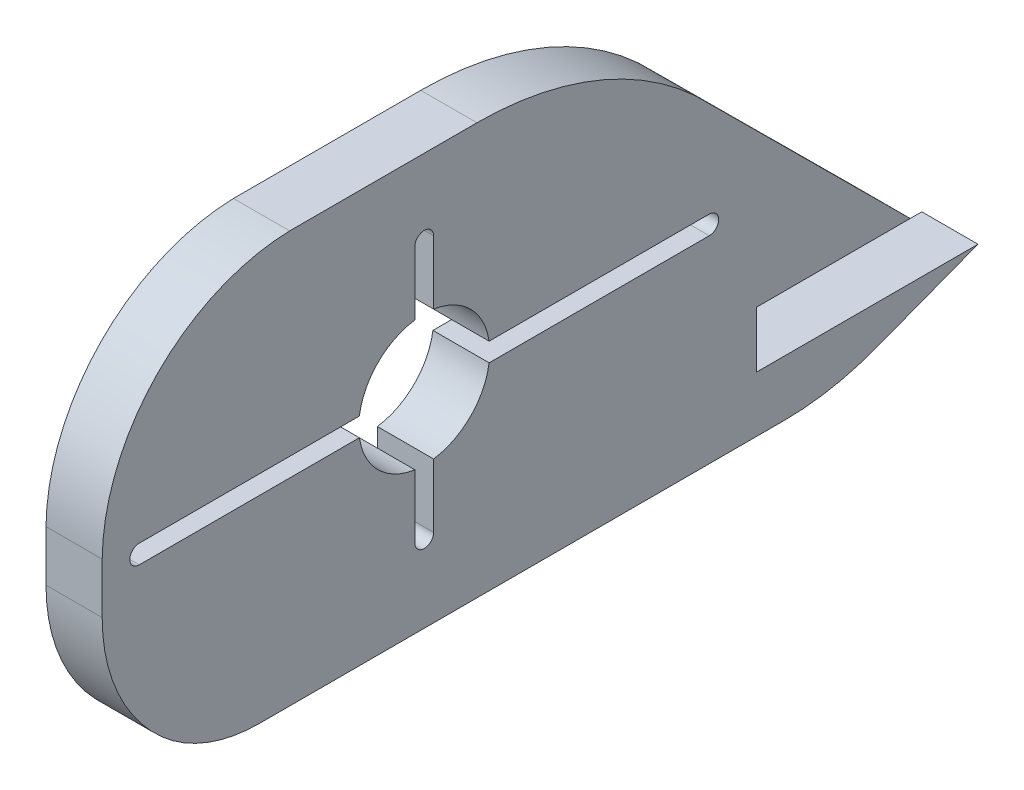
ISO-10303-21;
HEADER;
FILE_DESCRIPTION(('STEP AP214'),'2;1');
FILE_NAME('part.step','',(''),(''),'','','');
FILE_SCHEMA(('AUTOMOTIVE_DESIGN { 1 0 10303 214 1 1 1 1 }'));
ENDSEC;
DATA;
#1=APPLICATION_CONTEXT('core data for automotive mechanical design processes');
#2=APPLICATION_PROTOCOL_DEFINITION('international standard','automotive_design',2000,#1);
#3=PRODUCT_CONTEXT('',#1,'mechanical');
#4=PRODUCT('Part','Part','',(#3));
#5=PRODUCT_RELATED_PRODUCT_CATEGORY('part','',(#4));
#6=PRODUCT_DEFINITION_FORMATION('','',#4);
#7=PRODUCT_DEFINITION_CONTEXT('part definition',#1,'design');
#8=PRODUCT_DEFINITION('design','',#6,#7);
#9=PRODUCT_DEFINITION_SHAPE('','',#8);
#10=(LENGTH_UNIT() NAMED_UNIT(*) SI_UNIT(.MILLI.,.METRE.));
#11=(NAMED_UNIT(*) PLANE_ANGLE_UNIT() SI_UNIT($,.RADIAN.));
#12=(NAMED_UNIT(*) SI_UNIT($,.STERADIAN.) SOLID_ANGLE_UNIT());
#13=UNCERTAINTY_MEASURE_WITH_UNIT(LENGTH_MEASURE(1.E-05),#10,'distance_accuracy_value','');
#14=(GEOMETRIC_REPRESENTATION_CONTEXT(3) GLOBAL_UNCERTAINTY_ASSIGNED_CONTEXT((#13)) GLOBAL_UNIT_ASSIGNED_CONTEXT((#10,
#11,#12)) REPRESENTATION_CONTEXT('',''));
#15=CARTESIAN_POINT('',(0.,0.,0.));
#16=DIRECTION('',(0.,0.,1.));
#17=DIRECTION('',(1.,0.,0.));
#18=AXIS2_PLACEMENT_3D('',#15,#16,#17);
#19=CARTESIAN_POINT('',(-6.84524580259062,10.8976379940771,10.3620474706567));
#20=DIRECTION('',(-1.,0.,0.));
#21=DIRECTION('',(0.,0.,1.));
#22=AXIS2_PLACEMENT_3D('',#19,#20,#21);
#23=CYLINDRICAL_SURFACE('',#22,13.8733728569584);
#24=CARTESIAN_POINT('',(-9.84524580259062,10.8976379940771,10.3620474706567));
#25=DIRECTION('',(1.,0.,0.));
#26=DIRECTION('',(0.,0.,1.));
#27=AXIS2_PLACEMENT_3D('',#24,#25,#26);
#28=CIRCLE('',#27,13.8733728569584);
#29=CARTESIAN_POINT('',(-9.84524580259062,-2.9757348628813,10.3620474706567));
#30=VERTEX_POINT('',#29);
#31=CARTESIAN_POINT('',(-9.84524580259062,-2.06615789435317,5.42135211561724));
#32=VERTEX_POINT('',#31);
#33=EDGE_CURVE('E526',#30,#32,#28,.T.);
#34=ORIENTED_EDGE('',*,*,#33,.T.);
#35=DIRECTION('',(-1.,0.,0.));
#36=VECTOR('',#35,1.);
#37=CARTESIAN_POINT('',(-6.84524580259062,-2.06615789435317,5.42135211561724));
#38=LINE('',#37,#36);
#39=CARTESIAN_POINT('',(-6.84524580259062,-2.06615789435317,5.42135211561724));
#40=VERTEX_POINT('',#39);
#41=EDGE_CURVE('E569',#40,#32,#38,.T.);
#42=ORIENTED_EDGE('',*,*,#41,.F.);
#43=CARTESIAN_POINT('',(-6.84524580259062,10.8976379940771,10.3620474706567));
#44=DIRECTION('',(1.,0.,0.));
#45=DIRECTION('',(0.,0.,1.));
#46=AXIS2_PLACEMENT_3D('',#43,#44,#45);
#47=CIRCLE('',#46,13.8733728569584);
#48=CARTESIAN_POINT('',(-6.84524580259062,-2.9757348628813,10.3620474706567));
#49=VERTEX_POINT('',#48);
#50=EDGE_CURVE('E504',#49,#40,#47,.T.);
#51=ORIENTED_EDGE('',*,*,#50,.F.);
#52=DIRECTION('',(-1.,0.,0.));
#53=VECTOR('',#52,1.);
#54=CARTESIAN_POINT('',(-6.84524580259062,-2.9757348628813,10.3620474706567));
#55=LINE('',#54,#53);
#56=EDGE_CURVE('E566',#49,#30,#55,.T.);
#57=ORIENTED_EDGE('',*,*,#56,.T.);
#58=EDGE_LOOP('',(#34,#42,#51,#57));
#59=FACE_BOUND('',#58,.T.);
#60=ADVANCED_FACE('F174',(#59),#23,.T.);
#61=CARTESIAN_POINT('',(-6.84524580259062,0.,0.));
#62=DIRECTION('',(0.,0.93443721451832,0.356127915394516));
#63=DIRECTION('',(0.,-0.356127915394516,0.93443721451832));
#64=AXIS2_PLACEMENT_3D('',#61,#62,#63);
#65=PLANE('',#64);
#66=DIRECTION('',(0.,0.356127915394516,-0.93443721451832));
#67=VECTOR('',#66,1.);
#68=CARTESIAN_POINT('',(-9.84524580259062,0.,0.));
#69=LINE('',#68,#67);
#70=CARTESIAN_POINT('',(-9.84524580259062,0.,0.));
#71=VERTEX_POINT('',#70);
#72=EDGE_CURVE('E400',#32,#71,#69,.T.);
#73=ORIENTED_EDGE('',*,*,#72,.T.);
#74=DIRECTION('',(-1.,0.,0.));
#75=VECTOR('',#74,1.);
#76=CARTESIAN_POINT('',(-6.84524580259062,0.,0.));
#77=LINE('',#76,#75);
#78=CARTESIAN_POINT('',(-6.84524580259062,0.,0.));
#79=VERTEX_POINT('',#78);
#80=EDGE_CURVE('E523',#79,#71,#77,.T.);
#81=ORIENTED_EDGE('',*,*,#80,.F.);
#82=DIRECTION('',(0.,0.356127915394516,-0.93443721451832));
#83=VECTOR('',#82,1.);
#84=CARTESIAN_POINT('',(-6.84524580259062,0.,0.));
#85=LINE('',#84,#83);
#86=EDGE_CURVE('E502',#40,#79,#85,.T.);
#87=ORIENTED_EDGE('',*,*,#86,.F.);
#88=ORIENTED_EDGE('',*,*,#41,.T.);
#89=EDGE_LOOP('',(#73,#81,#87,#88));
#90=FACE_BOUND('',#89,.T.);
#91=ADVANCED_FACE('F582',(#90),#65,.F.);
#92=CARTESIAN_POINT('',(-6.84524580259062,8.0684379519903,29.5682002991371));
#93=DIRECTION('',(-1.,0.,0.));
#94=DIRECTION('',(0.,0.,1.));
#95=AXIS2_PLACEMENT_3D('',#92,#93,#94);
#96=CYLINDRICAL_SURFACE('',#95,3.5);
#97=CARTESIAN_POINT('',(-9.84524580259062,8.0684379519903,29.5682002991371));
#98=DIRECTION('',(-1.,0.,0.));
#99=DIRECTION('',(0.,0.,1.));
#100=AXIS2_PLACEMENT_3D('',#97,#98,#99);
#101=CIRCLE('',#100,3.5);
#102=CARTESIAN_POINT('',(-9.84524580259062,11.5325395671281,29.0682002991371));
#103=VERTEX_POINT('',#102);
#104=CARTESIAN_POINT('',(-9.84524580259062,8.5684379519903,26.1040986839993));
#105=VERTEX_POINT('',#104);
#106=EDGE_CURVE('E416',#103,#105,#101,.T.);
#107=ORIENTED_EDGE('',*,*,#106,.T.);
#108=DIRECTION('',(-1.,0.,0.));
#109=VECTOR('',#108,1.);
#110=CARTESIAN_POINT('',(-6.84524580259062,8.5684379519903,26.1040986839993));
#111=LINE('',#110,#109);
#112=CARTESIAN_POINT('',(-6.84524580259062,8.5684379519903,26.1040986839993));
#113=VERTEX_POINT('',#112);
#114=EDGE_CURVE('E409',#113,#105,#111,.T.);
#115=ORIENTED_EDGE('',*,*,#114,.F.);
#116=CARTESIAN_POINT('',(-6.84524580259062,8.0684379519903,29.5682002991371));
#117=DIRECTION('',(-1.,0.,0.));
#118=DIRECTION('',(0.,0.,1.));
#119=AXIS2_PLACEMENT_3D('',#116,#117,#118);
#120=CIRCLE('',#119,3.5);
#121=CARTESIAN_POINT('',(-6.84524580259062,11.5325395671281,29.0682002991371));
#122=VERTEX_POINT('',#121);
#123=EDGE_CURVE('E412',#122,#113,#120,.T.);
#124=ORIENTED_EDGE('',*,*,#123,.F.);
#125=DIRECTION('',(-1.,0.,0.));
#126=VECTOR('',#125,1.);
#127=CARTESIAN_POINT('',(-6.84524580259062,11.5325395671281,29.0682002991371));
#128=LINE('',#127,#126);
#129=EDGE_CURVE('E415',#122,#103,#128,.T.);
#130=ORIENTED_EDGE('',*,*,#129,.T.);
#131=EDGE_LOOP('',(#107,#115,#124,#130));
#132=FACE_BOUND('',#131,.T.);
#133=ADVANCED_FACE('F643',(#132),#96,.F.);
#134=CARTESIAN_POINT('',(-6.84524580259062,1.2134379519903,29.0682002991371));
#135=DIRECTION('',(0.,0.,1.));
#136=DIRECTION('',(0.,-1.,0.));
#137=AXIS2_PLACEMENT_3D('',#134,#135,#136);
#138=PLANE('',#137);
#139=ORIENTED_EDGE('',*,*,#129,.F.);
#140=DIRECTION('',(0.,1.,0.));
#141=VECTOR('',#140,1.);
#142=CARTESIAN_POINT('',(-6.84524580259062,1.2134379519903,29.0682002991371));
#143=LINE('',#142,#141);
#144=CARTESIAN_POINT('',(-6.84524580259062,14.9234379519903,29.0682002991371));
#145=VERTEX_POINT('',#144);
#146=EDGE_CURVE('E472',#122,#145,#143,.T.);
#147=ORIENTED_EDGE('',*,*,#146,.T.);
#148=DIRECTION('',(-1.,0.,0.));
#149=VECTOR('',#148,1.);
#150=CARTESIAN_POINT('',(-6.84524580259062,14.9234379519903,29.0682002991371));
#151=LINE('',#150,#149);
#152=CARTESIAN_POINT('',(-9.84524580259062,14.9234379519903,29.0682002991371));
#153=VERTEX_POINT('',#152);
#154=EDGE_CURVE('E484',#145,#153,#151,.T.);
#155=ORIENTED_EDGE('',*,*,#154,.T.);
#156=DIRECTION('',(0.,1.,0.));
#157=VECTOR('',#156,1.);
#158=CARTESIAN_POINT('',(-9.84524580259062,1.2134379519903,29.0682002991371));
#159=LINE('',#158,#157);
#160=EDGE_CURVE('E487',#103,#153,#159,.T.);
#161=ORIENTED_EDGE('',*,*,#160,.F.);
#162=EDGE_LOOP('',(#139,#147,#155,#161));
#163=FACE_BOUND('',#162,.T.);
#164=ADVANCED_FACE('F673',(#163),#138,.T.);
#165=CARTESIAN_POINT('',(-6.84524580259062,14.9234379519903,29.5682002991371));
#166=DIRECTION('',(-1.,0.,0.));
#167=DIRECTION('',(0.,0.,1.));
#168=AXIS2_PLACEMENT_3D('',#165,#166,#167);
#169=CYLINDRICAL_SURFACE('',#168,0.500000000000002);
#170=CARTESIAN_POINT('',(-9.84524580259062,14.9234379519903,29.5682002991371));
#171=DIRECTION('',(-1.,0.,0.));
#172=DIRECTION('',(0.,0.,1.));
#173=AXIS2_PLACEMENT_3D('',#170,#171,#172);
#174=CIRCLE('',#173,0.500000000000002);
#175=CARTESIAN_POINT('',(-9.84524580259062,14.9234379519903,30.0682002991371));
#176=VERTEX_POINT('',#175);
#177=EDGE_CURVE('E391',#176,#153,#174,.T.);
#178=ORIENTED_EDGE('',*,*,#177,.T.);
#179=ORIENTED_EDGE('',*,*,#154,.F.);
#180=CARTESIAN_POINT('',(-6.84524580259062,14.9234379519903,29.5682002991371));
#181=DIRECTION('',(-1.,0.,0.));
#182=DIRECTION('',(0.,0.,1.));
#183=AXIS2_PLACEMENT_3D('',#180,#181,#182);
#184=CIRCLE('',#183,0.500000000000002);
#185=CARTESIAN_POINT('',(-6.84524580259062,14.9234379519903,30.0682002991371));
#186=VERTEX_POINT('',#185);
#187=EDGE_CURVE('E469',#186,#145,#184,.T.);
#188=ORIENTED_EDGE('',*,*,#187,.F.);
#189=DIRECTION('',(-1.,0.,0.));
#190=VECTOR('',#189,1.);
#191=CARTESIAN_POINT('',(-6.84524580259062,14.9234379519903,30.0682002991371));
#192=LINE('',#191,#190);
#193=EDGE_CURVE('E452',#186,#176,#192,.T.);
#194=ORIENTED_EDGE('',*,*,#193,.T.);
#195=EDGE_LOOP('',(#178,#179,#188,#194));
#196=FACE_BOUND('',#195,.T.);
#197=ADVANCED_FACE('F703',(#196),#169,.F.);
#198=CARTESIAN_POINT('',(-6.84524580259062,1.2134379519903,30.0682002991371));
#199=DIRECTION('',(0.,0.,1.));
#200=DIRECTION('',(1.,0.,0.));
#201=AXIS2_PLACEMENT_3D('',#198,#199,#200);
#202=PLANE('',#201);
#203=DIRECTION('',(0.,1.,0.));
#204=VECTOR('',#203,1.);
#205=CARTESIAN_POINT('',(-9.84524580259062,1.2134379519903,30.0682002991371));
#206=LINE('',#205,#204);
#207=CARTESIAN_POINT('',(-9.84524580259062,11.5325395671281,30.0682002991371));
#208=VERTEX_POINT('',#207);
#209=EDGE_CURVE('E492',#208,#176,#206,.T.);
#210=ORIENTED_EDGE('',*,*,#209,.T.);
#211=ORIENTED_EDGE('',*,*,#193,.F.);
#212=DIRECTION('',(0.,1.,0.));
#213=VECTOR('',#212,1.);
#214=CARTESIAN_POINT('',(-6.84524580259062,1.2134379519903,30.0682002991371));
#215=LINE('',#214,#213);
#216=CARTESIAN_POINT('',(-6.84524580259062,11.5325395671281,30.0682002991371));
#217=VERTEX_POINT('',#216);
#218=EDGE_CURVE('E480',#217,#186,#215,.T.);
#219=ORIENTED_EDGE('',*,*,#218,.F.);
#220=DIRECTION('',(-1.,0.,0.));
#221=VECTOR('',#220,1.);
#222=CARTESIAN_POINT('',(-6.84524580259062,11.5325395671281,30.0682002991371));
#223=LINE('',#222,#221);
#224=EDGE_CURVE('E419',#217,#208,#223,.T.);
#225=ORIENTED_EDGE('',*,*,#224,.T.);
#226=EDGE_LOOP('',(#210,#211,#219,#225));
#227=FACE_BOUND('',#226,.T.);
#228=ADVANCED_FACE('F679',(#227),#202,.F.);
#229=CARTESIAN_POINT('',(-6.84524580259062,8.0684379519903,29.5682002991371));
#230=DIRECTION('',(-1.,0.,0.));
#231=DIRECTION('',(0.,0.,1.));
#232=AXIS2_PLACEMENT_3D('',#229,#230,#231);
#233=CYLINDRICAL_SURFACE('',#232,3.5);
#234=CARTESIAN_POINT('',(-9.84524580259062,8.0684379519903,29.5682002991371));
#235=DIRECTION('',(-1.,0.,0.));
#236=DIRECTION('',(0.,0.,1.));
#237=AXIS2_PLACEMENT_3D('',#234,#235,#236);
#238=CIRCLE('',#237,3.5);
#239=CARTESIAN_POINT('',(-9.84524580259062,8.5684379519903,33.0323019142749));
#240=VERTEX_POINT('',#239);
#241=EDGE_CURVE('E426',#240,#208,#238,.T.);
#242=ORIENTED_EDGE('',*,*,#241,.T.);
#243=ORIENTED_EDGE('',*,*,#224,.F.);
#244=CARTESIAN_POINT('',(-6.84524580259062,8.0684379519903,29.5682002991371));
#245=DIRECTION('',(-1.,0.,0.));
#246=DIRECTION('',(0.,0.,1.));
#247=AXIS2_PLACEMENT_3D('',#244,#245,#246);
#248=CIRCLE('',#247,3.5);
#249=CARTESIAN_POINT('',(-6.84524580259062,8.5684379519903,33.0323019142749));
#250=VERTEX_POINT('',#249);
#251=EDGE_CURVE('E422',#250,#217,#248,.T.);
#252=ORIENTED_EDGE('',*,*,#251,.F.);
#253=DIRECTION('',(-1.,0.,0.));
#254=VECTOR('',#253,1.);
#255=CARTESIAN_POINT('',(-6.84524580259062,8.5684379519903,33.0323019142749));
#256=LINE('',#255,#254);
#257=EDGE_CURVE('E425',#250,#240,#256,.T.);
#258=ORIENTED_EDGE('',*,*,#257,.T.);
#259=EDGE_LOOP('',(#242,#243,#252,#258));
#260=FACE_BOUND('',#259,.T.);
#261=ADVANCED_FACE('F675',(#260),#233,.F.);
#262=CARTESIAN_POINT('',(-6.84524580259062,8.5684379519903,14.3482002991371));
#263=DIRECTION('',(0.,-1.,0.));
#264=DIRECTION('',(0.,0.,-1.));
#265=AXIS2_PLACEMENT_3D('',#262,#263,#264);
#266=PLANE('',#265);
#267=ORIENTED_EDGE('',*,*,#257,.F.);
#268=DIRECTION('',(0.,0.,1.));
#269=VECTOR('',#268,1.);
#270=CARTESIAN_POINT('',(-6.84524580259062,8.5684379519903,14.3482002991371));
#271=LINE('',#270,#269);
#272=CARTESIAN_POINT('',(-6.84524580259062,8.56843795199031,44.7882002991371));
#273=VERTEX_POINT('',#272);
#274=EDGE_CURVE('E443',#250,#273,#271,.T.);
#275=ORIENTED_EDGE('',*,*,#274,.T.);
#276=DIRECTION('',(-1.,0.,0.));
#277=VECTOR('',#276,1.);
#278=CARTESIAN_POINT('',(-6.84524580259062,8.56843795199031,44.7882002991371));
#279=LINE('',#278,#277);
#280=CARTESIAN_POINT('',(-9.84524580259062,8.56843795199031,44.7882002991371));
#281=VERTEX_POINT('',#280);
#282=EDGE_CURVE('E463',#273,#281,#279,.T.);
#283=ORIENTED_EDGE('',*,*,#282,.T.);
#284=DIRECTION('',(0.,0.,1.));
#285=VECTOR('',#284,1.);
#286=CARTESIAN_POINT('',(-9.84524580259062,8.5684379519903,14.3482002991371));
#287=LINE('',#286,#285);
#288=EDGE_CURVE('E459',#240,#281,#287,.T.);
#289=ORIENTED_EDGE('',*,*,#288,.F.);
#290=EDGE_LOOP('',(#267,#275,#283,#289));
#291=FACE_BOUND('',#290,.T.);
#292=ADVANCED_FACE('F678',(#291),#266,.T.);
#293=CARTESIAN_POINT('',(-6.84524580259062,8.06843795199031,44.7882002991371));
#294=DIRECTION('',(-1.,0.,0.));
#295=DIRECTION('',(0.,0.,1.));
#296=AXIS2_PLACEMENT_3D('',#293,#294,#295);
#297=CYLINDRICAL_SURFACE('',#296,0.499999999999998);
#298=CARTESIAN_POINT('',(-9.84524580259062,8.06843795199031,44.7882002991371));
#299=DIRECTION('',(-1.,0.,0.));
#300=DIRECTION('',(0.,0.,1.));
#301=AXIS2_PLACEMENT_3D('',#298,#299,#300);
#302=CIRCLE('',#301,0.499999999999998);
#303=CARTESIAN_POINT('',(-9.84524580259062,7.56843795199031,44.7882002991371));
#304=VERTEX_POINT('',#303);
#305=EDGE_CURVE('E456',#304,#281,#302,.T.);
#306=ORIENTED_EDGE('',*,*,#305,.T.);
#307=ORIENTED_EDGE('',*,*,#282,.F.);
#308=CARTESIAN_POINT('',(-6.84524580259062,8.06843795199031,44.7882002991371));
#309=DIRECTION('',(-1.,0.,0.));
#310=DIRECTION('',(0.,0.,1.));
#311=AXIS2_PLACEMENT_3D('',#308,#309,#310);
#312=CIRCLE('',#311,0.499999999999998);
#313=CARTESIAN_POINT('',(-6.84524580259062,7.56843795199031,44.7882002991371));
#314=VERTEX_POINT('',#313);
#315=EDGE_CURVE('E440',#314,#273,#312,.T.);
#316=ORIENTED_EDGE('',*,*,#315,.F.);
#317=DIRECTION('',(-1.,0.,0.));
#318=VECTOR('',#317,1.);
#319=CARTESIAN_POINT('',(-6.84524580259062,7.56843795199031,44.7882002991371));
#320=LINE('',#319,#318);
#321=EDGE_CURVE('E465',#314,#304,#320,.T.);
#322=ORIENTED_EDGE('',*,*,#321,.T.);
#323=EDGE_LOOP('',(#306,#307,#316,#322));
#324=FACE_BOUND('',#323,.T.);
#325=ADVANCED_FACE('F683',(#324),#297,.F.);
#326=CARTESIAN_POINT('',(-6.84524580259062,7.5684379519903,14.3482002991371));
#327=DIRECTION('',(0.,-1.,0.));
#328=DIRECTION('',(0.,0.,-1.));
#329=AXIS2_PLACEMENT_3D('',#326,#327,#328);
#330=PLANE('',#329);
#331=DIRECTION('',(0.,0.,1.));
#332=VECTOR('',#331,1.);
#333=CARTESIAN_POINT('',(-9.84524580259062,7.5684379519903,14.3482002991371));
#334=LINE('',#333,#332);
#335=CARTESIAN_POINT('',(-9.84524580259062,7.56843795199031,33.0323019142749));
#336=VERTEX_POINT('',#335);
#337=EDGE_CURVE('E451',#336,#304,#334,.T.);
#338=ORIENTED_EDGE('',*,*,#337,.T.);
#339=ORIENTED_EDGE('',*,*,#321,.F.);
#340=DIRECTION('',(0.,0.,1.));
#341=VECTOR('',#340,1.);
#342=CARTESIAN_POINT('',(-6.84524580259062,7.5684379519903,14.3482002991371));
#343=LINE('',#342,#341);
#344=CARTESIAN_POINT('',(-6.84524580259062,7.56843795199031,33.0323019142749));
#345=VERTEX_POINT('',#344);
#346=EDGE_CURVE('E435',#345,#314,#343,.T.);
#347=ORIENTED_EDGE('',*,*,#346,.F.);
#348=DIRECTION('',(-1.,0.,0.));
#349=VECTOR('',#348,1.);
#350=CARTESIAN_POINT('',(-6.84524580259062,7.56843795199031,33.0323019142749));
#351=LINE('',#350,#349);
#352=EDGE_CURVE('E398',#345,#336,#351,.T.);
#353=ORIENTED_EDGE('',*,*,#352,.T.);
#354=EDGE_LOOP('',(#338,#339,#347,#353));
#355=FACE_BOUND('',#354,.T.);
#356=ADVANCED_FACE('F664',(#355),#330,.F.);
#357=CARTESIAN_POINT('',(-6.84524580259062,8.0684379519903,29.5682002991371));
#358=DIRECTION('',(-1.,0.,0.));
#359=DIRECTION('',(0.,0.,1.));
#360=AXIS2_PLACEMENT_3D('',#357,#358,#359);
#361=CYLINDRICAL_SURFACE('',#360,3.5);
#362=CARTESIAN_POINT('',(-9.84524580259062,8.0684379519903,29.5682002991371));
#363=DIRECTION('',(-1.,0.,0.));
#364=DIRECTION('',(0.,0.,1.));
#365=AXIS2_PLACEMENT_3D('',#362,#363,#364);
#366=CIRCLE('',#365,3.5);
#367=CARTESIAN_POINT('',(-9.84524580259062,4.60433633685255,30.0682002991371));
#368=VERTEX_POINT('',#367);
#369=EDGE_CURVE('E394',#368,#336,#366,.T.);
#370=ORIENTED_EDGE('',*,*,#369,.T.);
#371=ORIENTED_EDGE('',*,*,#352,.F.);
#372=CARTESIAN_POINT('',(-6.84524580259062,8.0684379519903,29.5682002991371));
#373=DIRECTION('',(-1.,0.,0.));
#374=DIRECTION('',(0.,0.,1.));
#375=AXIS2_PLACEMENT_3D('',#372,#373,#374);
#376=CIRCLE('',#375,3.5);
#377=CARTESIAN_POINT('',(-6.84524580259062,4.60433633685255,30.0682002991371));
#378=VERTEX_POINT('',#377);
#379=EDGE_CURVE('E197',#378,#345,#376,.T.);
#380=ORIENTED_EDGE('',*,*,#379,.F.);
#381=DIRECTION('',(-1.,0.,0.));
#382=VECTOR('',#381,1.);
#383=CARTESIAN_POINT('',(-6.84524580259062,4.60433633685255,30.0682002991371));
#384=LINE('',#383,#382);
#385=EDGE_CURVE('E393',#378,#368,#384,.T.);
#386=ORIENTED_EDGE('',*,*,#385,.T.);
#387=EDGE_LOOP('',(#370,#371,#380,#386));
#388=FACE_BOUND('',#387,.T.);
#389=ADVANCED_FACE('F660',(#388),#361,.F.);
#390=CARTESIAN_POINT('',(-6.84524580259062,1.2134379519903,30.0682002991371));
#391=VERTEX_POINT('',#390);
#392=EDGE_CURVE('E481',#391,#378,#215,.T.);
#393=ORIENTED_EDGE('',*,*,#392,.F.);
#394=DIRECTION('',(-1.,0.,0.));
#395=VECTOR('',#394,1.);
#396=CARTESIAN_POINT('',(-6.84524580259062,1.2134379519903,30.0682002991371));
#397=LINE('',#396,#395);
#398=CARTESIAN_POINT('',(-9.84524580259062,1.2134379519903,30.0682002991371));
#399=VERTEX_POINT('',#398);
#400=EDGE_CURVE('E497',#391,#399,#397,.T.);
#401=ORIENTED_EDGE('',*,*,#400,.T.);
#402=EDGE_CURVE('E473',#399,#368,#206,.T.);
#403=ORIENTED_EDGE('',*,*,#402,.T.);
#404=ORIENTED_EDGE('',*,*,#385,.F.);
#405=EDGE_LOOP('',(#393,#401,#403,#404));
#406=FACE_BOUND('',#405,.T.);
#407=ADVANCED_FACE('F663',(#406),#202,.F.);
#408=CARTESIAN_POINT('',(-6.84524580259062,1.2134379519903,29.5682002991371));
#409=DIRECTION('',(-1.,0.,0.));
#410=DIRECTION('',(0.,0.,1.));
#411=AXIS2_PLACEMENT_3D('',#408,#409,#410);
#412=CYLINDRICAL_SURFACE('',#411,0.5);
#413=CARTESIAN_POINT('',(-9.84524580259062,1.2134379519903,29.5682002991371));
#414=DIRECTION('',(-1.,0.,0.));
#415=DIRECTION('',(0.,0.,1.));
#416=AXIS2_PLACEMENT_3D('',#413,#414,#415);
#417=CIRCLE('',#416,0.5);
#418=CARTESIAN_POINT('',(-9.84524580259062,1.2134379519903,29.0682002991371));
#419=VERTEX_POINT('',#418);
#420=EDGE_CURVE('E189',#419,#399,#417,.T.);
#421=ORIENTED_EDGE('',*,*,#420,.T.);
#422=ORIENTED_EDGE('',*,*,#400,.F.);
#423=CARTESIAN_POINT('',(-6.84524580259062,1.2134379519903,29.5682002991371));
#424=DIRECTION('',(-1.,0.,0.));
#425=DIRECTION('',(0.,0.,1.));
#426=AXIS2_PLACEMENT_3D('',#423,#424,#425);
#427=CIRCLE('',#426,0.5);
#428=CARTESIAN_POINT('',(-6.84524580259062,1.2134379519903,29.0682002991371));
#429=VERTEX_POINT('',#428);
#430=EDGE_CURVE('E477',#429,#391,#427,.T.);
#431=ORIENTED_EDGE('',*,*,#430,.F.);
#432=DIRECTION('',(-1.,0.,0.));
#433=VECTOR('',#432,1.);
#434=CARTESIAN_POINT('',(-6.84524580259062,1.2134379519903,29.0682002991371));
#435=LINE('',#434,#433);
#436=EDGE_CURVE('E499',#429,#419,#435,.T.);
#437=ORIENTED_EDGE('',*,*,#436,.T.);
#438=EDGE_LOOP('',(#421,#422,#431,#437));
#439=FACE_BOUND('',#438,.T.);
#440=ADVANCED_FACE('F697',(#439),#412,.F.);
#441=DIRECTION('',(-1.,0.,0.));
#442=VECTOR('',#441,1.);
#443=CARTESIAN_POINT('',(-6.84524580259062,4.60433633685255,29.0682002991371));
#444=LINE('',#443,#442);
#445=CARTESIAN_POINT('',(-6.84524580259062,4.60433633685255,29.0682002991371));
#446=VERTEX_POINT('',#445);
#447=CARTESIAN_POINT('',(-9.84524580259062,4.60433633685255,29.0682002991371));
#448=VERTEX_POINT('',#447);
#449=EDGE_CURVE('E397',#446,#448,#444,.T.);
#450=ORIENTED_EDGE('',*,*,#449,.T.);
#451=EDGE_CURVE('E488',#419,#448,#159,.T.);
#452=ORIENTED_EDGE('',*,*,#451,.F.);
#453=ORIENTED_EDGE('',*,*,#436,.F.);
#454=EDGE_CURVE('E474',#429,#446,#143,.T.);
#455=ORIENTED_EDGE('',*,*,#454,.T.);
#456=EDGE_LOOP('',(#450,#452,#453,#455));
#457=FACE_BOUND('',#456,.T.);
#458=ADVANCED_FACE('F669',(#457),#138,.T.);
#459=CARTESIAN_POINT('',(-6.84524580259062,8.0684379519903,29.5682002991371));
#460=DIRECTION('',(-1.,0.,0.));
#461=DIRECTION('',(0.,0.,1.));
#462=AXIS2_PLACEMENT_3D('',#459,#460,#461);
#463=CYLINDRICAL_SURFACE('',#462,3.5);
#464=CARTESIAN_POINT('',(-9.84524580259062,8.0684379519903,29.5682002991371));
#465=DIRECTION('',(-1.,0.,0.));
#466=DIRECTION('',(0.,0.,1.));
#467=AXIS2_PLACEMENT_3D('',#464,#465,#466);
#468=CIRCLE('',#467,3.5);
#469=CARTESIAN_POINT('',(-9.84524580259062,7.5684379519903,26.1040986839993));
#470=VERTEX_POINT('',#469);
#471=EDGE_CURVE('E406',#470,#448,#468,.T.);
#472=ORIENTED_EDGE('',*,*,#471,.T.);
#473=ORIENTED_EDGE('',*,*,#449,.F.);
#474=CARTESIAN_POINT('',(-6.84524580259062,8.0684379519903,29.5682002991371));
#475=DIRECTION('',(-1.,0.,0.));
#476=DIRECTION('',(0.,0.,1.));
#477=AXIS2_PLACEMENT_3D('',#474,#475,#476);
#478=CIRCLE('',#477,3.5);
#479=CARTESIAN_POINT('',(-6.84524580259062,7.5684379519903,26.1040986839993));
#480=VERTEX_POINT('',#479);
#481=EDGE_CURVE('E402',#480,#446,#478,.T.);
#482=ORIENTED_EDGE('',*,*,#481,.F.);
#483=DIRECTION('',(-1.,0.,0.));
#484=VECTOR('',#483,1.);
#485=CARTESIAN_POINT('',(-6.84524580259062,7.5684379519903,26.1040986839993));
#486=LINE('',#485,#484);
#487=EDGE_CURVE('E405',#480,#470,#486,.T.);
#488=ORIENTED_EDGE('',*,*,#487,.T.);
#489=EDGE_LOOP('',(#472,#473,#482,#488));
#490=FACE_BOUND('',#489,.T.);
#491=ADVANCED_FACE('F665',(#490),#463,.F.);
#492=CARTESIAN_POINT('',(-6.84524580259062,7.5684379519903,14.3482002991371));
#493=VERTEX_POINT('',#492);
#494=EDGE_CURVE('E437',#493,#480,#343,.T.);
#495=ORIENTED_EDGE('',*,*,#494,.F.);
#496=DIRECTION('',(-1.,0.,0.));
#497=VECTOR('',#496,1.);
#498=CARTESIAN_POINT('',(-6.84524580259062,7.5684379519903,14.3482002991371));
#499=LINE('',#498,#497);
#500=CARTESIAN_POINT('',(-9.84524580259062,7.5684379519903,14.3482002991371));
#501=VERTEX_POINT('',#500);
#502=EDGE_CURVE('E447',#493,#501,#499,.T.);
#503=ORIENTED_EDGE('',*,*,#502,.T.);
#504=EDGE_CURVE('E453',#501,#470,#334,.T.);
#505=ORIENTED_EDGE('',*,*,#504,.T.);
#506=ORIENTED_EDGE('',*,*,#487,.F.);
#507=EDGE_LOOP('',(#495,#503,#505,#506));
#508=FACE_BOUND('',#507,.T.);
#509=ADVANCED_FACE('F668',(#508),#330,.F.);
#510=CARTESIAN_POINT('',(-6.84524580259062,8.0684379519903,14.3482002991371));
#511=DIRECTION('',(-1.,0.,0.));
#512=DIRECTION('',(0.,0.,1.));
#513=AXIS2_PLACEMENT_3D('',#510,#511,#512);
#514=CYLINDRICAL_SURFACE('',#513,0.5);
#515=CARTESIAN_POINT('',(-9.84524580259062,8.0684379519903,14.3482002991371));
#516=DIRECTION('',(-1.,0.,0.));
#517=DIRECTION('',(0.,0.,1.));
#518=AXIS2_PLACEMENT_3D('',#515,#516,#517);
#519=CIRCLE('',#518,0.5);
#520=CARTESIAN_POINT('',(-9.84524580259062,8.5684379519903,14.3482002991371));
#521=VERTEX_POINT('',#520);
#522=EDGE_CURVE('E448',#521,#501,#519,.T.);
#523=ORIENTED_EDGE('',*,*,#522,.T.);
#524=ORIENTED_EDGE('',*,*,#502,.F.);
#525=CARTESIAN_POINT('',(-6.84524580259062,8.0684379519903,14.3482002991371));
#526=DIRECTION('',(-1.,0.,0.));
#527=DIRECTION('',(0.,0.,1.));
#528=AXIS2_PLACEMENT_3D('',#525,#526,#527);
#529=CIRCLE('',#528,0.5);
#530=CARTESIAN_POINT('',(-6.84524580259062,8.5684379519903,14.3482002991371));
#531=VERTEX_POINT('',#530);
#532=EDGE_CURVE('E432',#531,#493,#529,.T.);
#533=ORIENTED_EDGE('',*,*,#532,.F.);
#534=DIRECTION('',(-1.,0.,0.));
#535=VECTOR('',#534,1.);
#536=CARTESIAN_POINT('',(-6.84524580259062,8.5684379519903,14.3482002991371));
#537=LINE('',#536,#535);
#538=EDGE_CURVE('E429',#531,#521,#537,.T.);
#539=ORIENTED_EDGE('',*,*,#538,.T.);
#540=EDGE_LOOP('',(#523,#524,#533,#539));
#541=FACE_BOUND('',#540,.T.);
#542=ADVANCED_FACE('F692',(#541),#514,.F.);
#543=ORIENTED_EDGE('',*,*,#114,.T.);
#544=EDGE_CURVE('E436',#521,#105,#287,.T.);
#545=ORIENTED_EDGE('',*,*,#544,.F.);
#546=ORIENTED_EDGE('',*,*,#538,.F.);
#547=EDGE_CURVE('E444',#531,#113,#271,.T.);
#548=ORIENTED_EDGE('',*,*,#547,.T.);
#549=EDGE_LOOP('',(#543,#545,#546,#548));
#550=FACE_BOUND('',#549,.T.);
#551=ADVANCED_FACE('F685',(#550),#266,.T.);
#552=CARTESIAN_POINT('',(-6.84524580259062,4.8597073591723,38.3620474706567));
#553=DIRECTION('',(-1.,0.,0.));
#554=DIRECTION('',(0.,0.,1.));
#555=AXIS2_PLACEMENT_3D('',#552,#553,#554);
#556=CYLINDRICAL_SURFACE('',#555,7.8354422220536);
#557=CARTESIAN_POINT('',(-9.84524580259062,4.8597073591723,38.3620474706567));
#558=DIRECTION('',(1.,0.,0.));
#559=DIRECTION('',(0.,0.,1.));
#560=AXIS2_PLACEMENT_3D('',#557,#558,#559);
#561=CIRCLE('',#560,7.8354422220536);
#562=CARTESIAN_POINT('',(-9.84524580259062,-1.01390135071814,43.5480744218246));
#563=VERTEX_POINT('',#562);
#564=CARTESIAN_POINT('',(-9.84524580259062,-2.97573486288131,38.3620474706567));
#565=VERTEX_POINT('',#564);
#566=EDGE_CURVE('E530',#563,#565,#561,.T.);
#567=ORIENTED_EDGE('',*,*,#566,.T.);
#568=DIRECTION('',(-1.,0.,0.));
#569=VECTOR('',#568,1.);
#570=CARTESIAN_POINT('',(-6.84524580259062,-2.97573486288131,38.3620474706567));
#571=LINE('',#570,#569);
#572=CARTESIAN_POINT('',(-6.84524580259062,-2.97573486288131,38.3620474706567));
#573=VERTEX_POINT('',#572);
#574=EDGE_CURVE('E563',#573,#565,#571,.T.);
#575=ORIENTED_EDGE('',*,*,#574,.F.);
#576=CARTESIAN_POINT('',(-6.84524580259062,4.8597073591723,38.3620474706567));
#577=DIRECTION('',(1.,0.,0.));
#578=DIRECTION('',(0.,0.,1.));
#579=AXIS2_PLACEMENT_3D('',#576,#577,#578);
#580=CIRCLE('',#579,7.8354422220536);
#581=CARTESIAN_POINT('',(-6.84524580259062,-1.01390135071814,43.5480744218246));
#582=VERTEX_POINT('',#581);
#583=EDGE_CURVE('E509',#582,#573,#580,.T.);
#584=ORIENTED_EDGE('',*,*,#583,.F.);
#585=DIRECTION('',(-1.,0.,0.));
#586=VECTOR('',#585,1.);
#587=CARTESIAN_POINT('',(-6.84524580259062,-1.01390135071814,43.5480744218246));
#588=LINE('',#587,#586);
#589=EDGE_CURVE('E560',#582,#563,#588,.T.);
#590=ORIENTED_EDGE('',*,*,#589,.T.);
#591=EDGE_LOOP('',(#567,#575,#584,#590));
#592=FACE_BOUND('',#591,.T.);
#593=ADVANCED_FACE('F597',(#592),#556,.T.);
#594=CARTESIAN_POINT('',(-6.84524580259062,6.11712297427611,37.2518285931603));
#595=DIRECTION('',(-1.,0.,0.));
#596=DIRECTION('',(0.,0.,1.));
#597=AXIS2_PLACEMENT_3D('',#594,#595,#596);
#598=CYLINDRICAL_SURFACE('',#597,9.51284497185947);
#599=CARTESIAN_POINT('',(-9.84524580259062,6.11712297427611,37.2518285931603));
#600=DIRECTION('',(1.,0.,0.));
#601=DIRECTION('',(0.,0.,1.));
#602=AXIS2_PLACEMENT_3D('',#599,#600,#601);
#603=CIRCLE('',#602,9.51284497185947);
#604=CARTESIAN_POINT('',(-9.84524580259062,6.11712297427611,46.7646735650198));
#605=VERTEX_POINT('',#604);
#606=EDGE_CURVE('E532',#605,#563,#603,.T.);
#607=ORIENTED_EDGE('',*,*,#606,.T.);
#608=ORIENTED_EDGE('',*,*,#589,.F.);
#609=CARTESIAN_POINT('',(-6.84524580259062,6.11712297427611,37.2518285931603));
#610=DIRECTION('',(1.,0.,0.));
#611=DIRECTION('',(0.,0.,1.));
#612=AXIS2_PLACEMENT_3D('',#609,#610,#611);
#613=CIRCLE('',#612,9.51284497185947);
#614=CARTESIAN_POINT('',(-6.84524580259062,6.11712297427611,46.7646735650198));
#615=VERTEX_POINT('',#614);
#616=EDGE_CURVE('E511',#615,#582,#613,.T.);
#617=ORIENTED_EDGE('',*,*,#616,.F.);
#618=DIRECTION('',(-1.,0.,0.));
#619=VECTOR('',#618,1.);
#620=CARTESIAN_POINT('',(-6.84524580259062,6.11712297427611,46.7646735650198));
#621=LINE('',#620,#619);
#622=EDGE_CURVE('E557',#615,#605,#621,.T.);
#623=ORIENTED_EDGE('',*,*,#622,.T.);
#624=EDGE_LOOP('',(#607,#608,#617,#623));
#625=FACE_BOUND('',#624,.T.);
#626=ADVANCED_FACE('F601',(#625),#598,.T.);
#627=CARTESIAN_POINT('',(-6.84524580259062,6.11712297427611,46.7646735650198));
#628=DIRECTION('',(0.,0.,-1.));
#629=DIRECTION('',(-1.,0.,0.));
#630=AXIS2_PLACEMENT_3D('',#627,#628,#629);
#631=PLANE('',#630);
#632=DIRECTION('',(0.,-1.,0.));
#633=VECTOR('',#632,1.);
#634=CARTESIAN_POINT('',(-9.84524580259062,6.11712297427611,46.7646735650198));
#635=LINE('',#634,#633);
#636=CARTESIAN_POINT('',(-9.84524580259062,8.82475871142375,46.7646735650198));
#637=VERTEX_POINT('',#636);
#638=EDGE_CURVE('E534',#637,#605,#635,.T.);
#639=ORIENTED_EDGE('',*,*,#638,.T.);
#640=ORIENTED_EDGE('',*,*,#622,.F.);
#641=DIRECTION('',(0.,-1.,0.));
#642=VECTOR('',#641,1.);
#643=CARTESIAN_POINT('',(-6.84524580259062,6.11712297427611,46.7646735650198));
#644=LINE('',#643,#642);
#645=CARTESIAN_POINT('',(-6.84524580259062,8.82475871142375,46.7646735650198));
#646=VERTEX_POINT('',#645);
#647=EDGE_CURVE('E513',#646,#615,#644,.T.);
#648=ORIENTED_EDGE('',*,*,#647,.F.);
#649=DIRECTION('',(-1.,0.,0.));
#650=VECTOR('',#649,1.);
#651=CARTESIAN_POINT('',(-6.84524580259062,8.82475871142375,46.7646735650198));
#652=LINE('',#651,#650);
#653=EDGE_CURVE('E554',#646,#637,#652,.T.);
#654=ORIENTED_EDGE('',*,*,#653,.T.);
#655=EDGE_LOOP('',(#639,#640,#648,#654));
#656=FACE_BOUND('',#655,.T.);
#657=ADVANCED_FACE('F607',(#656),#631,.F.);
#658=CARTESIAN_POINT('',(-6.84524580259062,8.72229752394956,36.4896627417071));
#659=DIRECTION('',(-1.,0.,0.));
#660=DIRECTION('',(0.,0.,1.));
#661=AXIS2_PLACEMENT_3D('',#658,#659,#660);
#662=CYLINDRICAL_SURFACE('',#661,10.275521676009);
#663=CARTESIAN_POINT('',(-9.84524580259062,8.72229752394956,36.4896627417071));
#664=DIRECTION('',(1.,0.,0.));
#665=DIRECTION('',(0.,0.,-1.));
#666=AXIS2_PLACEMENT_3D('',#663,#664,#665);
#667=CIRCLE('',#666,10.275521676009);
#668=CARTESIAN_POINT('',(-9.84524580259062,18.9943962825605,36.7548660740285));
#669=VERTEX_POINT('',#668);
#670=EDGE_CURVE('E536',#669,#637,#667,.T.);
#671=ORIENTED_EDGE('',*,*,#670,.T.);
#672=ORIENTED_EDGE('',*,*,#653,.F.);
#673=CARTESIAN_POINT('',(-6.84524580259062,8.72229752394956,36.4896627417071));
#674=DIRECTION('',(1.,0.,0.));
#675=DIRECTION('',(0.,0.,-1.));
#676=AXIS2_PLACEMENT_3D('',#673,#674,#675);
#677=CIRCLE('',#676,10.275521676009);
#678=CARTESIAN_POINT('',(-6.84524580259062,18.9943962825605,36.7548660740285));
#679=VERTEX_POINT('',#678);
#680=EDGE_CURVE('E515',#679,#646,#677,.T.);
#681=ORIENTED_EDGE('',*,*,#680,.F.);
#682=DIRECTION('',(-1.,0.,0.));
#683=VECTOR('',#682,1.);
#684=CARTESIAN_POINT('',(-6.84524580259062,18.9943962825605,36.7548660740285));
#685=LINE('',#684,#683);
#686=EDGE_CURVE('E551',#679,#669,#685,.T.);
#687=ORIENTED_EDGE('',*,*,#686,.T.);
#688=EDGE_LOOP('',(#671,#672,#681,#687));
#689=FACE_BOUND('',#688,.T.);
#690=ADVANCED_FACE('F612',(#689),#662,.T.);
#691=CARTESIAN_POINT('',(-6.84524580259062,18.9943962825605,36.7548660740285));
#692=DIRECTION('',(0.,-1.,0.));
#693=DIRECTION('',(0.,0.,-1.));
#694=AXIS2_PLACEMENT_3D('',#691,#692,#693);
#695=PLANE('',#694);
#696=DIRECTION('',(0.,0.,1.));
#697=VECTOR('',#696,1.);
#698=CARTESIAN_POINT('',(-9.84524580259062,18.9943962825605,36.7548660740285));
#699=LINE('',#698,#697);
#700=CARTESIAN_POINT('',(-9.84524580259062,18.9943962825605,26.7548660740285));
#701=VERTEX_POINT('',#700);
#702=EDGE_CURVE('E538',#701,#669,#699,.T.);
#703=ORIENTED_EDGE('',*,*,#702,.T.);
#704=ORIENTED_EDGE('',*,*,#686,.F.);
#705=DIRECTION('',(0.,0.,1.));
#706=VECTOR('',#705,1.);
#707=CARTESIAN_POINT('',(-6.84524580259062,18.9943962825605,36.7548660740285));
#708=LINE('',#707,#706);
#709=CARTESIAN_POINT('',(-6.84524580259062,18.9943962825605,26.7548660740285));
#710=VERTEX_POINT('',#709);
#711=EDGE_CURVE('E517',#710,#679,#708,.T.);
#712=ORIENTED_EDGE('',*,*,#711,.F.);
#713=DIRECTION('',(-1.,0.,0.));
#714=VECTOR('',#713,1.);
#715=CARTESIAN_POINT('',(-6.84524580259062,18.9943962825605,26.7548660740285));
#716=LINE('',#715,#714);
#717=EDGE_CURVE('E548',#710,#701,#716,.T.);
#718=ORIENTED_EDGE('',*,*,#717,.T.);
#719=EDGE_LOOP('',(#703,#704,#712,#718));
#720=FACE_BOUND('',#719,.T.);
#721=ADVANCED_FACE('F616',(#720),#695,.F.);
#722=CARTESIAN_POINT('',(-6.84524580259062,1.86707570076502,26.7548660740285));
#723=DIRECTION('',(-1.,0.,0.));
#724=DIRECTION('',(0.,0.,1.));
#725=AXIS2_PLACEMENT_3D('',#722,#723,#724);
#726=CYLINDRICAL_SURFACE('',#725,17.1273205817955);
#727=CARTESIAN_POINT('',(-9.84524580259062,1.86707570076502,26.7548660740285));
#728=DIRECTION('',(1.,0.,0.));
#729=DIRECTION('',(0.,0.,1.));
#730=AXIS2_PLACEMENT_3D('',#727,#728,#729);
#731=CIRCLE('',#730,17.1273205817955);
#732=CARTESIAN_POINT('',(-9.84524580259062,13.6377160838363,14.313116386625));
#733=VERTEX_POINT('',#732);
#734=EDGE_CURVE('E540',#733,#701,#731,.T.);
#735=ORIENTED_EDGE('',*,*,#734,.T.);
#736=ORIENTED_EDGE('',*,*,#717,.F.);
#737=CARTESIAN_POINT('',(-6.84524580259062,1.86707570076502,26.7548660740285));
#738=DIRECTION('',(1.,0.,0.));
#739=DIRECTION('',(0.,0.,1.));
#740=AXIS2_PLACEMENT_3D('',#737,#738,#739);
#741=CIRCLE('',#740,17.1273205817955);
#742=CARTESIAN_POINT('',(-6.84524580259062,13.6377160838363,14.313116386625));
#743=VERTEX_POINT('',#742);
#744=EDGE_CURVE('E519',#743,#710,#741,.T.);
#745=ORIENTED_EDGE('',*,*,#744,.F.);
#746=DIRECTION('',(-1.,0.,0.));
#747=VECTOR('',#746,1.);
#748=CARTESIAN_POINT('',(-6.84524580259062,13.6377160838363,14.313116386625));
#749=LINE('',#748,#747);
#750=EDGE_CURVE('E545',#743,#733,#749,.T.);
#751=ORIENTED_EDGE('',*,*,#750,.T.);
#752=EDGE_LOOP('',(#735,#736,#745,#751));
#753=FACE_BOUND('',#752,.T.);
#754=ADVANCED_FACE('F621',(#753),#726,.T.);
#755=CARTESIAN_POINT('',(-6.84524580259062,13.6377160838363,14.313116386625));
#756=DIRECTION('',(0.,-0.708989650881063,0.70521888442068));
#757=DIRECTION('',(0.,-0.70521888442068,-0.708989650881063));
#758=AXIS2_PLACEMENT_3D('',#755,#756,#757);
#759=PLANE('',#758);
#760=DIRECTION('',(0.,0.70521888442068,0.708989650881063));
#761=VECTOR('',#760,1.);
#762=CARTESIAN_POINT('',(-9.84524580259062,13.6377160838363,14.313116386625));
#763=LINE('',#762,#761);
#764=CARTESIAN_POINT('',(-9.84524580259062,3.,3.61852102188716));
#765=VERTEX_POINT('',#764);
#766=EDGE_CURVE('E505',#765,#733,#763,.T.);
#767=ORIENTED_EDGE('',*,*,#766,.T.);
#768=ORIENTED_EDGE('',*,*,#750,.F.);
#769=DIRECTION('',(0.,0.70521888442068,0.708989650881063));
#770=VECTOR('',#769,1.);
#771=CARTESIAN_POINT('',(-6.84524580259062,13.6377160838363,14.313116386625));
#772=LINE('',#771,#770);
#773=CARTESIAN_POINT('',(-6.84524580259062,3.,3.61852102188716));
#774=VERTEX_POINT('',#773);
#775=EDGE_CURVE('E521',#774,#743,#772,.T.);
#776=ORIENTED_EDGE('',*,*,#775,.F.);
#777=DIRECTION('',(-1.,0.,0.));
#778=VECTOR('',#777,1.);
#779=CARTESIAN_POINT('',(-6.84524580259062,3.,3.61852102188716));
#780=LINE('',#779,#778);
#781=EDGE_CURVE('E381',#774,#765,#780,.T.);
#782=ORIENTED_EDGE('',*,*,#781,.T.);
#783=EDGE_LOOP('',(#767,#768,#776,#782));
#784=FACE_BOUND('',#783,.T.);
#785=ADVANCED_FACE('F625',(#784),#759,.F.);
#786=CARTESIAN_POINT('',(-6.84524580259062,-2.9757348628813,10.3620474706567));
#787=DIRECTION('',(0.,1.,0.));
#788=DIRECTION('',(0.,0.,1.));
#789=AXIS2_PLACEMENT_3D('',#786,#787,#788);
#790=PLANE('',#789);
#791=DIRECTION('',(0.,0.,-1.));
#792=VECTOR('',#791,1.);
#793=CARTESIAN_POINT('',(-9.84524580259062,-2.9757348628813,10.3620474706567));
#794=LINE('',#793,#792);
#795=EDGE_CURVE('E528',#565,#30,#794,.T.);
#796=ORIENTED_EDGE('',*,*,#795,.T.);
#797=ORIENTED_EDGE('',*,*,#56,.F.);
#798=DIRECTION('',(0.,0.,-1.));
#799=VECTOR('',#798,1.);
#800=CARTESIAN_POINT('',(-6.84524580259062,-2.9757348628813,10.3620474706567));
#801=LINE('',#800,#799);
#802=EDGE_CURVE('E507',#573,#49,#801,.T.);
#803=ORIENTED_EDGE('',*,*,#802,.F.);
#804=ORIENTED_EDGE('',*,*,#574,.T.);
#805=EDGE_LOOP('',(#796,#797,#803,#804));
#806=FACE_BOUND('',#805,.T.);
#807=ADVANCED_FACE('F592',(#806),#790,.F.);
#808=CARTESIAN_POINT('',(-9.84524580259062,3.,0.));
#809=DIRECTION('',(1.,0.,0.));
#810=DIRECTION('',(0.,0.,-1.));
#811=AXIS2_PLACEMENT_3D('',#808,#809,#810);
#812=PLANE('',#811);
#813=DIRECTION('',(0.,-1.,0.));
#814=VECTOR('',#813,1.);
#815=CARTESIAN_POINT('',(-9.84524580259062,3.,11.8182002991371));
#816=LINE('',#815,#814);
#817=CARTESIAN_POINT('',(-9.84524580259059,3.,11.8182002991371));
#818=VERTEX_POINT('',#817);
#819=CARTESIAN_POINT('',(-9.84524580259059,0.,11.8182002991371));
#820=VERTEX_POINT('',#819);
#821=EDGE_CURVE('E386',#818,#820,#816,.T.);
#822=ORIENTED_EDGE('',*,*,#821,.T.);
#823=DIRECTION('',(0.,0.,-1.));
#824=VECTOR('',#823,1.);
#825=CARTESIAN_POINT('',(-9.84524580259062,0.,0.));
#826=LINE('',#825,#824);
#827=EDGE_CURVE('E182',#820,#71,#826,.T.);
#828=ORIENTED_EDGE('',*,*,#827,.T.);
#829=ORIENTED_EDGE('',*,*,#72,.F.);
#830=ORIENTED_EDGE('',*,*,#33,.F.);
#831=ORIENTED_EDGE('',*,*,#795,.F.);
#832=ORIENTED_EDGE('',*,*,#566,.F.);
#833=ORIENTED_EDGE('',*,*,#606,.F.);
#834=ORIENTED_EDGE('',*,*,#638,.F.);
#835=ORIENTED_EDGE('',*,*,#670,.F.);
#836=ORIENTED_EDGE('',*,*,#702,.F.);
#837=ORIENTED_EDGE('',*,*,#734,.F.);
#838=ORIENTED_EDGE('',*,*,#766,.F.);
#839=DIRECTION('',(0.,0.,-1.));
#840=VECTOR('',#839,1.);
#841=CARTESIAN_POINT('',(-9.84524580259062,3.,0.));
#842=LINE('',#841,#840);
#843=EDGE_CURVE('E544',#818,#765,#842,.T.);
#844=ORIENTED_EDGE('',*,*,#843,.F.);
#845=EDGE_LOOP('',(#822,#828,#829,#830,#831,#832,#833,#834,#835,#836,#837,#838,#844));
#846=FACE_BOUND('',#845,.T.);
#847=ORIENTED_EDGE('',*,*,#544,.T.);
#848=ORIENTED_EDGE('',*,*,#106,.F.);
#849=ORIENTED_EDGE('',*,*,#160,.T.);
#850=ORIENTED_EDGE('',*,*,#177,.F.);
#851=ORIENTED_EDGE('',*,*,#209,.F.);
#852=ORIENTED_EDGE('',*,*,#241,.F.);
#853=ORIENTED_EDGE('',*,*,#288,.T.);
#854=ORIENTED_EDGE('',*,*,#305,.F.);
#855=ORIENTED_EDGE('',*,*,#337,.F.);
#856=ORIENTED_EDGE('',*,*,#369,.F.);
#857=ORIENTED_EDGE('',*,*,#402,.F.);
#858=ORIENTED_EDGE('',*,*,#420,.F.);
#859=ORIENTED_EDGE('',*,*,#451,.T.);
#860=ORIENTED_EDGE('',*,*,#471,.F.);
#861=ORIENTED_EDGE('',*,*,#504,.F.);
#862=ORIENTED_EDGE('',*,*,#522,.F.);
#863=EDGE_LOOP('',(#847,#848,#849,#850,#851,#852,#853,#854,#855,#856,#857,#858,#859,#860,#861,#862));
#864=FACE_BOUND('',#863,.T.);
#865=ADVANCED_FACE('F176',(#846,#864),#812,.F.);
#866=CARTESIAN_POINT('',(26.8452458025906,0.,11.8182002991371));
#867=DIRECTION('',(0.,-1.,0.));
#868=DIRECTION('',(0.,0.,-1.));
#869=AXIS2_PLACEMENT_3D('',#866,#867,#868);
#870=PLANE('',#869);
#871=DIRECTION('',(-1.,0.,0.));
#872=VECTOR('',#871,1.);
#873=CARTESIAN_POINT('',(26.8452458025906,0.,11.8182002991371));
#874=LINE('',#873,#872);
#875=CARTESIAN_POINT('',(-6.84524580259062,0.,11.8182002991371));
#876=VERTEX_POINT('',#875);
#877=EDGE_CURVE('E382',#876,#820,#874,.T.);
#878=ORIENTED_EDGE('',*,*,#877,.F.);
#879=DIRECTION('',(0.,0.,1.));
#880=VECTOR('',#879,1.);
#881=CARTESIAN_POINT('',(-6.84524580259062,0.,0.));
#882=LINE('',#881,#880);
#883=EDGE_CURVE('E370',#79,#876,#882,.T.);
#884=ORIENTED_EDGE('',*,*,#883,.F.);
#885=ORIENTED_EDGE('',*,*,#80,.T.);
#886=ORIENTED_EDGE('',*,*,#827,.F.);
#887=EDGE_LOOP('',(#878,#884,#885,#886));
#888=FACE_BOUND('',#887,.T.);
#889=ADVANCED_FACE('F647',(#888),#870,.F.);
#890=CARTESIAN_POINT('',(-6.84524580259062,3.,0.));
#891=DIRECTION('',(-1.,0.,0.));
#892=DIRECTION('',(0.,0.,1.));
#893=AXIS2_PLACEMENT_3D('',#890,#891,#892);
#894=PLANE('',#893);
#895=ORIENTED_EDGE('',*,*,#883,.T.);
#896=DIRECTION('',(0.,-1.,0.));
#897=VECTOR('',#896,1.);
#898=CARTESIAN_POINT('',(-6.84524580259062,3.,11.8182002991371));
#899=LINE('',#898,#897);
#900=CARTESIAN_POINT('',(-6.84524580259062,3.,11.8182002991371));
#901=VERTEX_POINT('',#900);
#902=EDGE_CURVE('E12',#901,#876,#899,.T.);
#903=ORIENTED_EDGE('',*,*,#902,.F.);
#904=DIRECTION('',(0.,0.,-1.));
#905=VECTOR('',#904,1.);
#906=CARTESIAN_POINT('',(-6.84524580259062,3.,0.));
#907=LINE('',#906,#905);
#908=EDGE_CURVE('E367',#901,#774,#907,.T.);
#909=ORIENTED_EDGE('',*,*,#908,.T.);
#910=ORIENTED_EDGE('',*,*,#775,.T.);
#911=ORIENTED_EDGE('',*,*,#744,.T.);
#912=ORIENTED_EDGE('',*,*,#711,.T.);
#913=ORIENTED_EDGE('',*,*,#680,.T.);
#914=ORIENTED_EDGE('',*,*,#647,.T.);
#915=ORIENTED_EDGE('',*,*,#616,.T.);
#916=ORIENTED_EDGE('',*,*,#583,.T.);
#917=ORIENTED_EDGE('',*,*,#802,.T.);
#918=ORIENTED_EDGE('',*,*,#50,.T.);
#919=ORIENTED_EDGE('',*,*,#86,.T.);
#920=EDGE_LOOP('',(#895,#903,#909,#910,#911,#912,#913,#914,#915,#916,#917,#918,#919));
#921=FACE_BOUND('',#920,.T.);
#922=ORIENTED_EDGE('',*,*,#547,.F.);
#923=ORIENTED_EDGE('',*,*,#532,.T.);
#924=ORIENTED_EDGE('',*,*,#494,.T.);
#925=ORIENTED_EDGE('',*,*,#481,.T.);
#926=ORIENTED_EDGE('',*,*,#454,.F.);
#927=ORIENTED_EDGE('',*,*,#430,.T.);
#928=ORIENTED_EDGE('',*,*,#392,.T.);
#929=ORIENTED_EDGE('',*,*,#379,.T.);
#930=ORIENTED_EDGE('',*,*,#346,.T.);
#931=ORIENTED_EDGE('',*,*,#315,.T.);
#932=ORIENTED_EDGE('',*,*,#274,.F.);
#933=ORIENTED_EDGE('',*,*,#251,.T.);
#934=ORIENTED_EDGE('',*,*,#218,.T.);
#935=ORIENTED_EDGE('',*,*,#187,.T.);
#936=ORIENTED_EDGE('',*,*,#146,.F.);
#937=ORIENTED_EDGE('',*,*,#123,.T.);
#938=EDGE_LOOP('',(#922,#923,#924,#925,#926,#927,#928,#929,#930,#931,#932,#933,#934,#935,#936,#937));
#939=FACE_BOUND('',#938,.T.);
#940=ADVANCED_FACE('F365',(#921,#939),#894,.F.);
#941=CARTESIAN_POINT('',(26.8452458025906,3.,11.8182002991371));
#942=DIRECTION('',(0.,1.,0.));
#943=DIRECTION('',(0.,0.,1.));
#944=AXIS2_PLACEMENT_3D('',#941,#942,#943);
#945=PLANE('',#944);
#946=ORIENTED_EDGE('',*,*,#781,.F.);
#947=ORIENTED_EDGE('',*,*,#908,.F.);
#948=DIRECTION('',(-1.,0.,0.));
#949=VECTOR('',#948,1.);
#950=CARTESIAN_POINT('',(26.8452458025906,3.,11.8182002991371));
#951=LINE('',#950,#949);
#952=EDGE_CURVE('E378',#901,#818,#951,.T.);
#953=ORIENTED_EDGE('',*,*,#952,.T.);
#954=ORIENTED_EDGE('',*,*,#843,.T.);
#955=EDGE_LOOP('',(#946,#947,#953,#954));
#956=FACE_BOUND('',#955,.T.);
#957=ADVANCED_FACE('F377',(#956),#945,.F.);
#958=CARTESIAN_POINT('',(26.8452458025906,3.,11.8182002991371));
#959=DIRECTION('',(0.,0.,1.));
#960=DIRECTION('',(1.,0.,0.));
#961=AXIS2_PLACEMENT_3D('',#958,#959,#960);
#962=PLANE('',#961);
#963=ORIENTED_EDGE('',*,*,#952,.F.);
#964=ORIENTED_EDGE('',*,*,#902,.T.);
#965=ORIENTED_EDGE('',*,*,#877,.T.);
#966=ORIENTED_EDGE('',*,*,#821,.F.);
#967=EDGE_LOOP('',(#963,#964,#965,#966));
#968=FACE_BOUND('',#967,.T.);
#969=ADVANCED_FACE('F384',(#968),#962,.F.);
#970=CLOSED_SHELL('',(#60,#91,#133,#164,#197,#228,#261,#292,#325,#356,#389,#407,#440,#458,#491,
#509,#542,#551,#593,#626,#657,#690,#721,#754,#785,#807,#865,#889,#940,#957,#969));
#971=MANIFOLD_SOLID_BREP('B2',#970);
#972=ADVANCED_BREP_SHAPE_REPRESENTATION('',(#18,#971),#14);
#973=SHAPE_DEFINITION_REPRESENTATION(#9,#972);
ENDSEC;
END-ISO-10303-21;
